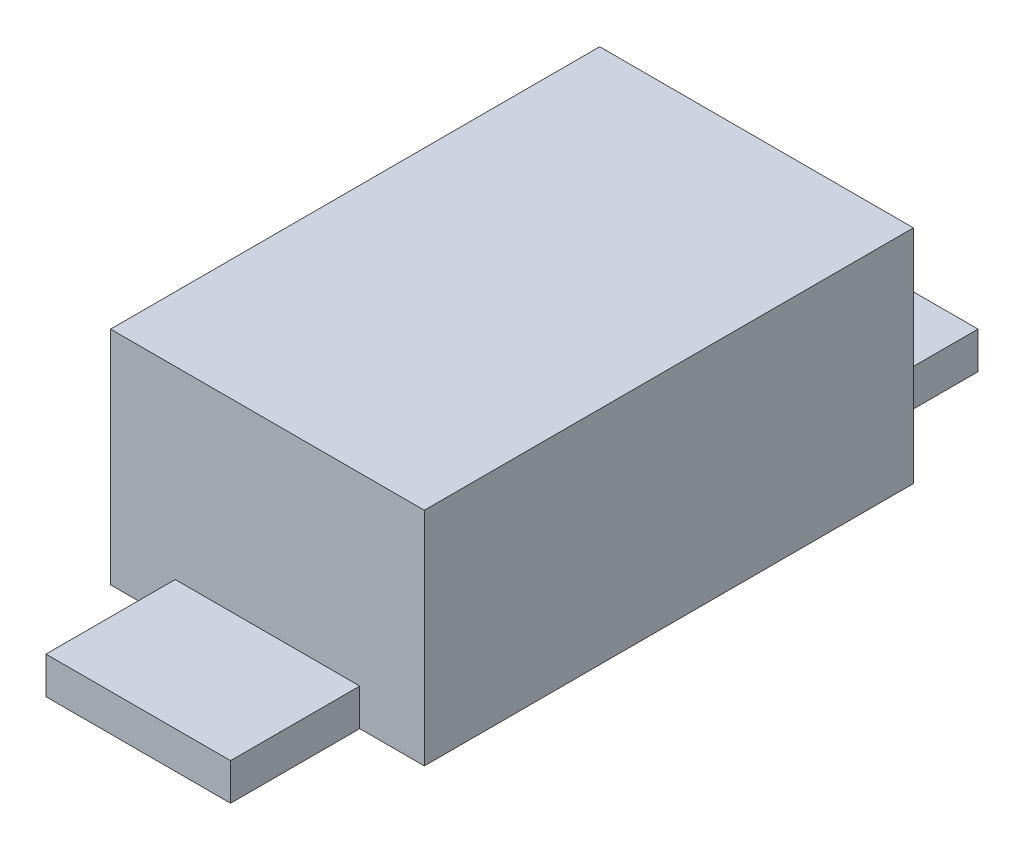
ISO-10303-21;
HEADER;
FILE_DESCRIPTION(('STEP AP214'),'2;1');
FILE_NAME('part.step','',(''),(''),'','','');
FILE_SCHEMA(('AUTOMOTIVE_DESIGN { 1 0 10303 214 1 1 1 1 }'));
ENDSEC;
DATA;
#1=APPLICATION_CONTEXT('core data for automotive mechanical design processes');
#2=APPLICATION_PROTOCOL_DEFINITION('international standard','automotive_design',2000,#1);
#3=PRODUCT_CONTEXT('',#1,'mechanical');
#4=PRODUCT('Part','Part','',(#3));
#5=PRODUCT_RELATED_PRODUCT_CATEGORY('part','',(#4));
#6=PRODUCT_DEFINITION_FORMATION('','',#4);
#7=PRODUCT_DEFINITION_CONTEXT('part definition',#1,'design');
#8=PRODUCT_DEFINITION('design','',#6,#7);
#9=PRODUCT_DEFINITION_SHAPE('','',#8);
#10=(LENGTH_UNIT() NAMED_UNIT(*) SI_UNIT(.MILLI.,.METRE.));
#11=(NAMED_UNIT(*) PLANE_ANGLE_UNIT() SI_UNIT($,.RADIAN.));
#12=(NAMED_UNIT(*) SI_UNIT($,.STERADIAN.) SOLID_ANGLE_UNIT());
#13=UNCERTAINTY_MEASURE_WITH_UNIT(LENGTH_MEASURE(1.E-05),#10,'distance_accuracy_value','');
#14=(GEOMETRIC_REPRESENTATION_CONTEXT(3) GLOBAL_UNCERTAINTY_ASSIGNED_CONTEXT((#13)) GLOBAL_UNIT_ASSIGNED_CONTEXT((#10,
#11,#12)) REPRESENTATION_CONTEXT('',''));
#15=CARTESIAN_POINT('',(0.,0.,0.));
#16=DIRECTION('',(0.,0.,1.));
#17=DIRECTION('',(1.,0.,0.));
#18=AXIS2_PLACEMENT_3D('',#15,#16,#17);
#19=CARTESIAN_POINT('',(-6.89824359691987,1.2,7.12251176230315));
#20=DIRECTION('',(0.,0.,1.));
#21=DIRECTION('',(1.,0.,0.));
#22=AXIS2_PLACEMENT_3D('',#19,#20,#21);
#23=PLANE('',#22);
#24=DIRECTION('',(0.,-1.,0.));
#25=VECTOR('',#24,1.);
#26=CARTESIAN_POINT('',(-5.54824359691987,0.,7.12251176230315));
#27=LINE('',#26,#25);
#28=CARTESIAN_POINT('',(-5.54824359691987,0.2,7.12251176230315));
#29=VERTEX_POINT('',#28);
#30=CARTESIAN_POINT('',(-5.54824359691987,0.,7.12251176230315));
#31=VERTEX_POINT('',#30);
#32=EDGE_CURVE('E37',#29,#31,#27,.T.);
#33=ORIENTED_EDGE('',*,*,#32,.F.);
#34=DIRECTION('',(1.,0.,0.));
#35=VECTOR('',#34,1.);
#36=CARTESIAN_POINT('',(-5.54824359691987,0.2,7.12251176230315));
#37=LINE('',#36,#35);
#38=CARTESIAN_POINT('',(-6.54824359691987,0.2,7.12251176230315));
#39=VERTEX_POINT('',#38);
#40=EDGE_CURVE('E144',#39,#29,#37,.T.);
#41=ORIENTED_EDGE('',*,*,#40,.F.);
#42=DIRECTION('',(0.,1.,0.));
#43=VECTOR('',#42,1.);
#44=CARTESIAN_POINT('',(-6.54824359691987,0.,7.12251176230315));
#45=LINE('',#44,#43);
#46=CARTESIAN_POINT('',(-6.54824359691987,0.,7.12251176230315));
#47=VERTEX_POINT('',#46);
#48=EDGE_CURVE('E56',#47,#39,#45,.T.);
#49=ORIENTED_EDGE('',*,*,#48,.F.);
#50=DIRECTION('',(-1.,0.,0.));
#51=VECTOR('',#50,1.);
#52=CARTESIAN_POINT('',(-6.89824359691987,0.,7.12251176230315));
#53=LINE('',#52,#51);
#54=CARTESIAN_POINT('',(-6.89824359691987,0.,7.12251176230315));
#55=VERTEX_POINT('',#54);
#56=EDGE_CURVE('E161',#47,#55,#53,.T.);
#57=ORIENTED_EDGE('',*,*,#56,.T.);
#58=DIRECTION('',(0.,-1.,0.));
#59=VECTOR('',#58,1.);
#60=CARTESIAN_POINT('',(-6.89824359691987,1.2,7.12251176230315));
#61=LINE('',#60,#59);
#62=CARTESIAN_POINT('',(-6.89824359691987,1.2,7.12251176230315));
#63=VERTEX_POINT('',#62);
#64=EDGE_CURVE('E170',#63,#55,#61,.T.);
#65=ORIENTED_EDGE('',*,*,#64,.F.);
#66=DIRECTION('',(-1.,0.,0.));
#67=VECTOR('',#66,1.);
#68=CARTESIAN_POINT('',(-6.89824359691987,1.2,7.12251176230315));
#69=LINE('',#68,#67);
#70=CARTESIAN_POINT('',(-5.19824359691987,1.2,7.12251176230315));
#71=VERTEX_POINT('',#70);
#72=EDGE_CURVE('E175',#71,#63,#69,.T.);
#73=ORIENTED_EDGE('',*,*,#72,.F.);
#74=DIRECTION('',(0.,-1.,0.));
#75=VECTOR('',#74,1.);
#76=CARTESIAN_POINT('',(-5.19824359691987,1.2,7.12251176230315));
#77=LINE('',#76,#75);
#78=CARTESIAN_POINT('',(-5.19824359691987,0.,7.12251176230315));
#79=VERTEX_POINT('',#78);
#80=EDGE_CURVE('E174',#71,#79,#77,.T.);
#81=ORIENTED_EDGE('',*,*,#80,.T.);
#82=EDGE_CURVE('E164',#79,#31,#53,.T.);
#83=ORIENTED_EDGE('',*,*,#82,.T.);
#84=EDGE_LOOP('',(#33,#41,#49,#57,#65,#73,#81,#83));
#85=FACE_BOUND('',#84,.T.);
#86=ADVANCED_FACE('F33',(#85),#23,.F.);
#87=CARTESIAN_POINT('',(-6.89824359691987,1.2,9.77251176230315));
#88=DIRECTION('',(0.,0.,-1.));
#89=DIRECTION('',(-1.,0.,0.));
#90=AXIS2_PLACEMENT_3D('',#87,#88,#89);
#91=PLANE('',#90);
#92=DIRECTION('',(0.,-1.,0.));
#93=VECTOR('',#92,1.);
#94=CARTESIAN_POINT('',(-6.54824359691987,0.,9.77251176230315));
#95=LINE('',#94,#93);
#96=CARTESIAN_POINT('',(-6.54824359691987,0.2,9.77251176230315));
#97=VERTEX_POINT('',#96);
#98=CARTESIAN_POINT('',(-6.54824359691987,0.,9.77251176230315));
#99=VERTEX_POINT('',#98);
#100=EDGE_CURVE('E147',#97,#99,#95,.T.);
#101=ORIENTED_EDGE('',*,*,#100,.F.);
#102=DIRECTION('',(-1.,0.,0.));
#103=VECTOR('',#102,1.);
#104=CARTESIAN_POINT('',(-6.54824359691987,0.2,9.77251176230315));
#105=LINE('',#104,#103);
#106=CARTESIAN_POINT('',(-5.54824359691987,0.2,9.77251176230315));
#107=VERTEX_POINT('',#106);
#108=EDGE_CURVE('E207',#107,#97,#105,.T.);
#109=ORIENTED_EDGE('',*,*,#108,.F.);
#110=DIRECTION('',(0.,1.,0.));
#111=VECTOR('',#110,1.);
#112=CARTESIAN_POINT('',(-5.54824359691987,0.,9.77251176230315));
#113=LINE('',#112,#111);
#114=CARTESIAN_POINT('',(-5.54824359691987,0.,9.77251176230315));
#115=VERTEX_POINT('',#114);
#116=EDGE_CURVE('E150',#115,#107,#113,.T.);
#117=ORIENTED_EDGE('',*,*,#116,.F.);
#118=DIRECTION('',(1.,0.,0.));
#119=VECTOR('',#118,1.);
#120=CARTESIAN_POINT('',(-6.89824359691987,0.,9.77251176230315));
#121=LINE('',#120,#119);
#122=CARTESIAN_POINT('',(-5.19824359691987,0.,9.77251176230315));
#123=VERTEX_POINT('',#122);
#124=EDGE_CURVE('E182',#115,#123,#121,.T.);
#125=ORIENTED_EDGE('',*,*,#124,.T.);
#126=DIRECTION('',(0.,-1.,0.));
#127=VECTOR('',#126,1.);
#128=CARTESIAN_POINT('',(-5.19824359691987,1.2,9.77251176230315));
#129=LINE('',#128,#127);
#130=CARTESIAN_POINT('',(-5.19824359691987,1.2,9.77251176230315));
#131=VERTEX_POINT('',#130);
#132=EDGE_CURVE('E43',#131,#123,#129,.T.);
#133=ORIENTED_EDGE('',*,*,#132,.F.);
#134=DIRECTION('',(1.,0.,0.));
#135=VECTOR('',#134,1.);
#136=CARTESIAN_POINT('',(-6.89824359691987,1.2,9.77251176230315));
#137=LINE('',#136,#135);
#138=CARTESIAN_POINT('',(-6.89824359691987,1.2,9.77251176230315));
#139=VERTEX_POINT('',#138);
#140=EDGE_CURVE('E194',#139,#131,#137,.T.);
#141=ORIENTED_EDGE('',*,*,#140,.F.);
#142=DIRECTION('',(0.,-1.,0.));
#143=VECTOR('',#142,1.);
#144=CARTESIAN_POINT('',(-6.89824359691987,1.2,9.77251176230315));
#145=LINE('',#144,#143);
#146=CARTESIAN_POINT('',(-6.89824359691987,0.,9.77251176230315));
#147=VERTEX_POINT('',#146);
#148=EDGE_CURVE('E11',#139,#147,#145,.T.);
#149=ORIENTED_EDGE('',*,*,#148,.T.);
#150=EDGE_CURVE('E180',#147,#99,#121,.T.);
#151=ORIENTED_EDGE('',*,*,#150,.T.);
#152=EDGE_LOOP('',(#101,#109,#117,#125,#133,#141,#149,#151));
#153=FACE_BOUND('',#152,.T.);
#154=ADVANCED_FACE('F257',(#153),#91,.F.);
#155=CARTESIAN_POINT('',(-6.89824359691987,1.2,7.12251176230315));
#156=DIRECTION('',(1.,0.,0.));
#157=DIRECTION('',(0.,0.,-1.));
#158=AXIS2_PLACEMENT_3D('',#155,#156,#157);
#159=PLANE('',#158);
#160=DIRECTION('',(0.,0.,1.));
#161=VECTOR('',#160,1.);
#162=CARTESIAN_POINT('',(-6.89824359691987,0.,7.12251176230315));
#163=LINE('',#162,#161);
#164=EDGE_CURVE('E186',#55,#147,#163,.T.);
#165=ORIENTED_EDGE('',*,*,#164,.T.);
#166=ORIENTED_EDGE('',*,*,#148,.F.);
#167=DIRECTION('',(0.,0.,1.));
#168=VECTOR('',#167,1.);
#169=CARTESIAN_POINT('',(-6.89824359691987,1.2,7.12251176230315));
#170=LINE('',#169,#168);
#171=EDGE_CURVE('E196',#63,#139,#170,.T.);
#172=ORIENTED_EDGE('',*,*,#171,.F.);
#173=ORIENTED_EDGE('',*,*,#64,.T.);
#174=EDGE_LOOP('',(#165,#166,#172,#173));
#175=FACE_BOUND('',#174,.T.);
#176=ADVANCED_FACE('F35',(#175),#159,.F.);
#177=CARTESIAN_POINT('',(-5.19824359691987,1.2,7.12251176230315));
#178=DIRECTION('',(-1.,0.,0.));
#179=DIRECTION('',(0.,0.,1.));
#180=AXIS2_PLACEMENT_3D('',#177,#178,#179);
#181=PLANE('',#180);
#182=DIRECTION('',(0.,0.,-1.));
#183=VECTOR('',#182,1.);
#184=CARTESIAN_POINT('',(-5.19824359691987,0.,7.12251176230315));
#185=LINE('',#184,#183);
#186=EDGE_CURVE('E165',#123,#79,#185,.T.);
#187=ORIENTED_EDGE('',*,*,#186,.T.);
#188=ORIENTED_EDGE('',*,*,#80,.F.);
#189=DIRECTION('',(0.,0.,-1.));
#190=VECTOR('',#189,1.);
#191=CARTESIAN_POINT('',(-5.19824359691987,1.2,7.12251176230315));
#192=LINE('',#191,#190);
#193=EDGE_CURVE('E192',#131,#71,#192,.T.);
#194=ORIENTED_EDGE('',*,*,#193,.F.);
#195=ORIENTED_EDGE('',*,*,#132,.T.);
#196=EDGE_LOOP('',(#187,#188,#194,#195));
#197=FACE_BOUND('',#196,.T.);
#198=ADVANCED_FACE('F265',(#197),#181,.F.);
#199=CARTESIAN_POINT('',(0.,1.2,0.));
#200=DIRECTION('',(0.,1.,0.));
#201=DIRECTION('',(0.,0.,1.));
#202=AXIS2_PLACEMENT_3D('',#199,#200,#201);
#203=PLANE('',#202);
#204=ORIENTED_EDGE('',*,*,#171,.T.);
#205=ORIENTED_EDGE('',*,*,#140,.T.);
#206=ORIENTED_EDGE('',*,*,#193,.T.);
#207=ORIENTED_EDGE('',*,*,#72,.T.);
#208=EDGE_LOOP('',(#204,#205,#206,#207));
#209=FACE_BOUND('',#208,.T.);
#210=ADVANCED_FACE('F267',(#209),#203,.T.);
#211=CARTESIAN_POINT('',(0.,0.,0.));
#212=DIRECTION('',(0.,1.,0.));
#213=DIRECTION('',(0.,0.,1.));
#214=AXIS2_PLACEMENT_3D('',#211,#212,#213);
#215=PLANE('',#214);
#216=ORIENTED_EDGE('',*,*,#164,.F.);
#217=ORIENTED_EDGE('',*,*,#56,.F.);
#218=DIRECTION('',(0.,0.,1.));
#219=VECTOR('',#218,1.);
#220=CARTESIAN_POINT('',(-6.54824359691987,0.,6.42251176230315));
#221=LINE('',#220,#219);
#222=CARTESIAN_POINT('',(-6.54824359691987,0.,6.42251176230315));
#223=VERTEX_POINT('',#222);
#224=EDGE_CURVE('E131',#223,#47,#221,.T.);
#225=ORIENTED_EDGE('',*,*,#224,.F.);
#226=DIRECTION('',(-1.,0.,0.));
#227=VECTOR('',#226,1.);
#228=CARTESIAN_POINT('',(-5.54824359691987,0.,6.42251176230315));
#229=LINE('',#228,#227);
#230=CARTESIAN_POINT('',(-5.54824359691987,0.,6.42251176230315));
#231=VERTEX_POINT('',#230);
#232=EDGE_CURVE('E123',#231,#223,#229,.T.);
#233=ORIENTED_EDGE('',*,*,#232,.F.);
#234=DIRECTION('',(0.,0.,1.));
#235=VECTOR('',#234,1.);
#236=CARTESIAN_POINT('',(-5.54824359691987,0.,6.42251176230315));
#237=LINE('',#236,#235);
#238=EDGE_CURVE('E129',#231,#31,#237,.T.);
#239=ORIENTED_EDGE('',*,*,#238,.T.);
#240=ORIENTED_EDGE('',*,*,#82,.F.);
#241=ORIENTED_EDGE('',*,*,#186,.F.);
#242=ORIENTED_EDGE('',*,*,#124,.F.);
#243=DIRECTION('',(0.,0.,-1.));
#244=VECTOR('',#243,1.);
#245=CARTESIAN_POINT('',(-5.54824359691987,0.,10.4725117623031));
#246=LINE('',#245,#244);
#247=CARTESIAN_POINT('',(-5.54824359691987,0.,10.4725117623031));
#248=VERTEX_POINT('',#247);
#249=EDGE_CURVE('E202',#248,#115,#246,.T.);
#250=ORIENTED_EDGE('',*,*,#249,.F.);
#251=DIRECTION('',(1.,0.,0.));
#252=VECTOR('',#251,1.);
#253=CARTESIAN_POINT('',(-6.54824359691987,0.,10.4725117623031));
#254=LINE('',#253,#252);
#255=CARTESIAN_POINT('',(-6.54824359691987,0.,10.4725117623031));
#256=VERTEX_POINT('',#255);
#257=EDGE_CURVE('E240',#256,#248,#254,.T.);
#258=ORIENTED_EDGE('',*,*,#257,.F.);
#259=DIRECTION('',(0.,0.,-1.));
#260=VECTOR('',#259,1.);
#261=CARTESIAN_POINT('',(-6.54824359691987,0.,10.4725117623031));
#262=LINE('',#261,#260);
#263=EDGE_CURVE('E190',#256,#99,#262,.T.);
#264=ORIENTED_EDGE('',*,*,#263,.T.);
#265=ORIENTED_EDGE('',*,*,#150,.F.);
#266=EDGE_LOOP('',(#216,#217,#225,#233,#239,#240,#241,#242,#250,#258,#264,#265));
#267=FACE_BOUND('',#266,.T.);
#268=ADVANCED_FACE('F126',(#267),#215,.F.);
#269=CARTESIAN_POINT('',(-6.54824359691987,0.,10.4725117623031));
#270=DIRECTION('',(1.,0.,0.));
#271=DIRECTION('',(0.,0.,-1.));
#272=AXIS2_PLACEMENT_3D('',#269,#270,#271);
#273=PLANE('',#272);
#274=ORIENTED_EDGE('',*,*,#100,.T.);
#275=ORIENTED_EDGE('',*,*,#263,.F.);
#276=DIRECTION('',(0.,-1.,0.));
#277=VECTOR('',#276,1.);
#278=CARTESIAN_POINT('',(-6.54824359691987,0.,10.4725117623031));
#279=LINE('',#278,#277);
#280=CARTESIAN_POINT('',(-6.54824359691987,0.2,10.4725117623031));
#281=VERTEX_POINT('',#280);
#282=EDGE_CURVE('E210',#281,#256,#279,.T.);
#283=ORIENTED_EDGE('',*,*,#282,.F.);
#284=DIRECTION('',(0.,0.,-1.));
#285=VECTOR('',#284,1.);
#286=CARTESIAN_POINT('',(-6.54824359691987,0.2,10.4725117623031));
#287=LINE('',#286,#285);
#288=EDGE_CURVE('E203',#281,#97,#287,.T.);
#289=ORIENTED_EDGE('',*,*,#288,.T.);
#290=EDGE_LOOP('',(#274,#275,#283,#289));
#291=FACE_BOUND('',#290,.T.);
#292=ADVANCED_FACE('F286',(#291),#273,.F.);
#293=CARTESIAN_POINT('',(-5.54824359691987,0.,10.4725117623031));
#294=DIRECTION('',(-1.,0.,0.));
#295=DIRECTION('',(0.,0.,1.));
#296=AXIS2_PLACEMENT_3D('',#293,#294,#295);
#297=PLANE('',#296);
#298=ORIENTED_EDGE('',*,*,#116,.T.);
#299=DIRECTION('',(0.,0.,-1.));
#300=VECTOR('',#299,1.);
#301=CARTESIAN_POINT('',(-5.54824359691987,0.2,10.4725117623031));
#302=LINE('',#301,#300);
#303=CARTESIAN_POINT('',(-5.54824359691987,0.2,10.4725117623031));
#304=VERTEX_POINT('',#303);
#305=EDGE_CURVE('E199',#304,#107,#302,.T.);
#306=ORIENTED_EDGE('',*,*,#305,.F.);
#307=DIRECTION('',(0.,1.,0.));
#308=VECTOR('',#307,1.);
#309=CARTESIAN_POINT('',(-5.54824359691987,0.,10.4725117623031));
#310=LINE('',#309,#308);
#311=EDGE_CURVE('E239',#248,#304,#310,.T.);
#312=ORIENTED_EDGE('',*,*,#311,.F.);
#313=ORIENTED_EDGE('',*,*,#249,.T.);
#314=EDGE_LOOP('',(#298,#306,#312,#313));
#315=FACE_BOUND('',#314,.T.);
#316=ADVANCED_FACE('F227',(#315),#297,.F.);
#317=CARTESIAN_POINT('',(-6.54824359691987,0.2,10.4725117623031));
#318=DIRECTION('',(0.,-1.,0.));
#319=DIRECTION('',(0.,0.,-1.));
#320=AXIS2_PLACEMENT_3D('',#317,#318,#319);
#321=PLANE('',#320);
#322=ORIENTED_EDGE('',*,*,#108,.T.);
#323=ORIENTED_EDGE('',*,*,#288,.F.);
#324=DIRECTION('',(-1.,0.,0.));
#325=VECTOR('',#324,1.);
#326=CARTESIAN_POINT('',(-6.54824359691987,0.2,10.4725117623031));
#327=LINE('',#326,#325);
#328=EDGE_CURVE('E206',#304,#281,#327,.T.);
#329=ORIENTED_EDGE('',*,*,#328,.F.);
#330=ORIENTED_EDGE('',*,*,#305,.T.);
#331=EDGE_LOOP('',(#322,#323,#329,#330));
#332=FACE_BOUND('',#331,.T.);
#333=ADVANCED_FACE('F234',(#332),#321,.F.);
#334=CARTESIAN_POINT('',(0.,0.,10.4725117623031));
#335=DIRECTION('',(0.,0.,-1.));
#336=DIRECTION('',(-1.,0.,0.));
#337=AXIS2_PLACEMENT_3D('',#334,#335,#336);
#338=PLANE('',#337);
#339=ORIENTED_EDGE('',*,*,#282,.T.);
#340=ORIENTED_EDGE('',*,*,#257,.T.);
#341=ORIENTED_EDGE('',*,*,#311,.T.);
#342=ORIENTED_EDGE('',*,*,#328,.T.);
#343=EDGE_LOOP('',(#339,#340,#341,#342));
#344=FACE_BOUND('',#343,.T.);
#345=ADVANCED_FACE('F284',(#344),#338,.F.);
#346=CARTESIAN_POINT('',(-5.54824359691987,0.,6.42251176230315));
#347=DIRECTION('',(-1.,0.,0.));
#348=DIRECTION('',(0.,0.,1.));
#349=AXIS2_PLACEMENT_3D('',#346,#347,#348);
#350=PLANE('',#349);
#351=ORIENTED_EDGE('',*,*,#32,.T.);
#352=ORIENTED_EDGE('',*,*,#238,.F.);
#353=DIRECTION('',(0.,-1.,0.));
#354=VECTOR('',#353,1.);
#355=CARTESIAN_POINT('',(-5.54824359691987,0.,6.42251176230315));
#356=LINE('',#355,#354);
#357=CARTESIAN_POINT('',(-5.54824359691987,0.2,6.42251176230315));
#358=VERTEX_POINT('',#357);
#359=EDGE_CURVE('E135',#358,#231,#356,.T.);
#360=ORIENTED_EDGE('',*,*,#359,.F.);
#361=DIRECTION('',(0.,0.,1.));
#362=VECTOR('',#361,1.);
#363=CARTESIAN_POINT('',(-5.54824359691987,0.2,6.42251176230315));
#364=LINE('',#363,#362);
#365=EDGE_CURVE('E246',#358,#29,#364,.T.);
#366=ORIENTED_EDGE('',*,*,#365,.T.);
#367=EDGE_LOOP('',(#351,#352,#360,#366));
#368=FACE_BOUND('',#367,.T.);
#369=ADVANCED_FACE('F146',(#368),#350,.F.);
#370=CARTESIAN_POINT('',(-6.54824359691987,0.,6.42251176230315));
#371=DIRECTION('',(1.,0.,0.));
#372=DIRECTION('',(0.,0.,-1.));
#373=AXIS2_PLACEMENT_3D('',#370,#371,#372);
#374=PLANE('',#373);
#375=ORIENTED_EDGE('',*,*,#48,.T.);
#376=DIRECTION('',(0.,0.,1.));
#377=VECTOR('',#376,1.);
#378=CARTESIAN_POINT('',(-6.54824359691987,0.2,6.42251176230315));
#379=LINE('',#378,#377);
#380=CARTESIAN_POINT('',(-6.54824359691987,0.2,6.42251176230315));
#381=VERTEX_POINT('',#380);
#382=EDGE_CURVE('E152',#381,#39,#379,.T.);
#383=ORIENTED_EDGE('',*,*,#382,.F.);
#384=DIRECTION('',(0.,1.,0.));
#385=VECTOR('',#384,1.);
#386=CARTESIAN_POINT('',(-6.54824359691987,0.,6.42251176230315));
#387=LINE('',#386,#385);
#388=EDGE_CURVE('E134',#223,#381,#387,.T.);
#389=ORIENTED_EDGE('',*,*,#388,.F.);
#390=ORIENTED_EDGE('',*,*,#224,.T.);
#391=EDGE_LOOP('',(#375,#383,#389,#390));
#392=FACE_BOUND('',#391,.T.);
#393=ADVANCED_FACE('F253',(#392),#374,.F.);
#394=CARTESIAN_POINT('',(-5.54824359691987,0.2,6.42251176230315));
#395=DIRECTION('',(0.,-1.,0.));
#396=DIRECTION('',(0.,0.,-1.));
#397=AXIS2_PLACEMENT_3D('',#394,#395,#396);
#398=PLANE('',#397);
#399=ORIENTED_EDGE('',*,*,#40,.T.);
#400=ORIENTED_EDGE('',*,*,#365,.F.);
#401=DIRECTION('',(1.,0.,0.));
#402=VECTOR('',#401,1.);
#403=CARTESIAN_POINT('',(-5.54824359691987,0.2,6.42251176230315));
#404=LINE('',#403,#402);
#405=EDGE_CURVE('E140',#381,#358,#404,.T.);
#406=ORIENTED_EDGE('',*,*,#405,.F.);
#407=ORIENTED_EDGE('',*,*,#382,.T.);
#408=EDGE_LOOP('',(#399,#400,#406,#407));
#409=FACE_BOUND('',#408,.T.);
#410=ADVANCED_FACE('F255',(#409),#398,.F.);
#411=CARTESIAN_POINT('',(0.,0.,6.42251176230315));
#412=DIRECTION('',(0.,0.,1.));
#413=DIRECTION('',(1.,0.,0.));
#414=AXIS2_PLACEMENT_3D('',#411,#412,#413);
#415=PLANE('',#414);
#416=ORIENTED_EDGE('',*,*,#359,.T.);
#417=ORIENTED_EDGE('',*,*,#232,.T.);
#418=ORIENTED_EDGE('',*,*,#388,.T.);
#419=ORIENTED_EDGE('',*,*,#405,.T.);
#420=EDGE_LOOP('',(#416,#417,#418,#419));
#421=FACE_BOUND('',#420,.T.);
#422=ADVANCED_FACE('F138',(#421),#415,.F.);
#423=CLOSED_SHELL('',(#86,#154,#176,#198,#210,#268,#292,#316,#333,#345,#369,#393,#410,#422));
#424=MANIFOLD_SOLID_BREP('B2',#423);
#425=ADVANCED_BREP_SHAPE_REPRESENTATION('',(#18,#424),#14);
#426=SHAPE_DEFINITION_REPRESENTATION(#9,#425);
ENDSEC;
END-ISO-10303-21;
